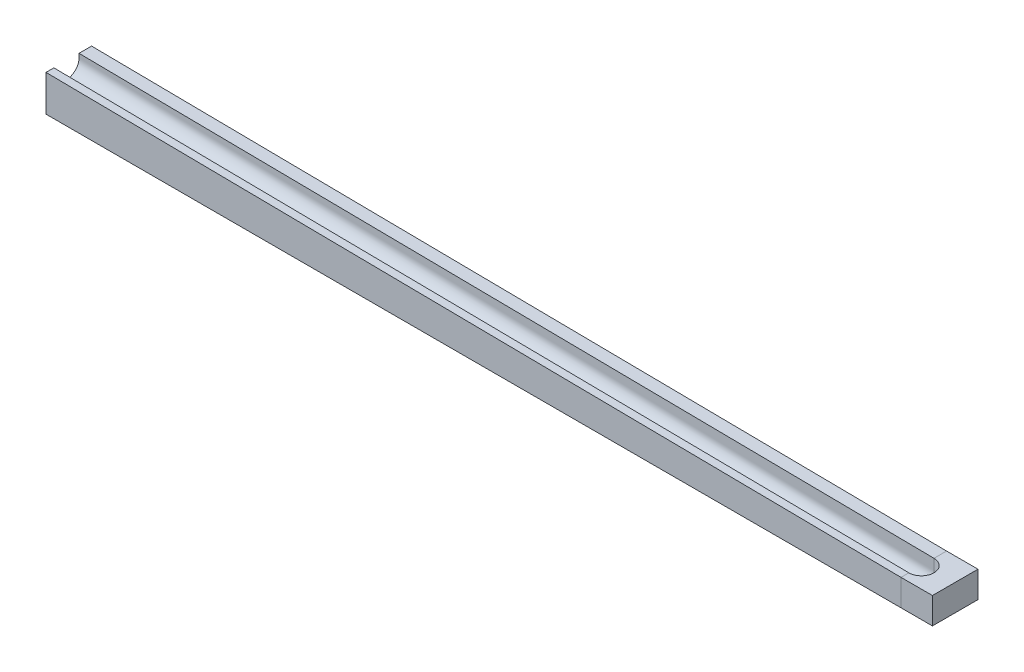
ISO-10303-21;
HEADER;
FILE_DESCRIPTION(('STEP AP214'),'2;1');
FILE_NAME('part.step','',(''),(''),'','','');
FILE_SCHEMA(('AUTOMOTIVE_DESIGN { 1 0 10303 214 1 1 1 1 }'));
ENDSEC;
DATA;
#1=APPLICATION_CONTEXT('core data for automotive mechanical design processes');
#2=APPLICATION_PROTOCOL_DEFINITION('international standard','automotive_design',2000,#1);
#3=PRODUCT_CONTEXT('',#1,'mechanical');
#4=PRODUCT('Part','Part','',(#3));
#5=PRODUCT_RELATED_PRODUCT_CATEGORY('part','',(#4));
#6=PRODUCT_DEFINITION_FORMATION('','',#4);
#7=PRODUCT_DEFINITION_CONTEXT('part definition',#1,'design');
#8=PRODUCT_DEFINITION('design','',#6,#7);
#9=PRODUCT_DEFINITION_SHAPE('','',#8);
#10=(LENGTH_UNIT() NAMED_UNIT(*) SI_UNIT(.MILLI.,.METRE.));
#11=(NAMED_UNIT(*) PLANE_ANGLE_UNIT() SI_UNIT($,.RADIAN.));
#12=(NAMED_UNIT(*) SI_UNIT($,.STERADIAN.) SOLID_ANGLE_UNIT());
#13=UNCERTAINTY_MEASURE_WITH_UNIT(LENGTH_MEASURE(1.E-05),#10,'distance_accuracy_value','');
#14=(GEOMETRIC_REPRESENTATION_CONTEXT(3) GLOBAL_UNCERTAINTY_ASSIGNED_CONTEXT((#13)) GLOBAL_UNIT_ASSIGNED_CONTEXT((#10,
#11,#12)) REPRESENTATION_CONTEXT('',''));
#15=CARTESIAN_POINT('',(0.,0.,0.));
#16=DIRECTION('',(0.,0.,1.));
#17=DIRECTION('',(1.,0.,0.));
#18=AXIS2_PLACEMENT_3D('',#15,#16,#17);
#19=CARTESIAN_POINT('',(1727.2,0.,0.));
#20=DIRECTION('',(1.,0.,0.));
#21=DIRECTION('',(0.,0.,-1.));
#22=AXIS2_PLACEMENT_3D('',#19,#20,#21);
#23=PLANE('',#22);
#24=CARTESIAN_POINT('',(1727.2,53.2712453558564,-25.4));
#25=DIRECTION('',(0.,0.,1.));
#26=VECTOR('',#25,1.);
#27=LINE('',#24,#26);
#28=CARTESIAN_POINT('',(1727.2,53.2712453558564,-25.4));
#29=VERTEX_POINT('',#28);
#30=CARTESIAN_POINT('',(1727.2,53.2712453558564,-9.525));
#31=VERTEX_POINT('',#30);
#32=EDGE_CURVE('E533',#29,#31,#27,.T.);
#33=ORIENTED_EDGE('',*,*,#32,.T.);
#34=DIRECTION('',(0.,-1.,0.));
#35=VECTOR('',#34,1.);
#36=CARTESIAN_POINT('',(1727.2,0.,-9.525));
#37=LINE('',#36,#35);
#38=CARTESIAN_POINT('',(1727.2,0.,-9.525));
#39=VERTEX_POINT('',#38);
#40=EDGE_CURVE('E367',#31,#39,#37,.T.);
#41=ORIENTED_EDGE('',*,*,#40,.T.);
#42=DIRECTION('',(0.,0.,1.));
#43=VECTOR('',#42,1.);
#44=CARTESIAN_POINT('',(1727.2,0.,-101.6));
#45=LINE('',#44,#43);
#46=CARTESIAN_POINT('',(1727.2,0.,-101.6));
#47=VERTEX_POINT('',#46);
#48=EDGE_CURVE('E361',#47,#39,#45,.T.);
#49=ORIENTED_EDGE('',*,*,#48,.F.);
#50=DIRECTION('',(0.,-1.,0.));
#51=VECTOR('',#50,1.);
#52=CARTESIAN_POINT('',(1727.2,53.2712453558564,-101.6));
#53=LINE('',#52,#51);
#54=CARTESIAN_POINT('',(1727.2,53.2712453558564,-101.6));
#55=VERTEX_POINT('',#54);
#56=EDGE_CURVE('E366',#55,#47,#53,.T.);
#57=ORIENTED_EDGE('',*,*,#56,.F.);
#58=CARTESIAN_POINT('',(1727.2,53.2712453558564,-101.6));
#59=DIRECTION('',(0.,0.,1.));
#60=VECTOR('',#59,1.);
#61=LINE('',#58,#60);
#62=CARTESIAN_POINT('',(1727.2,53.2712453558564,-76.2));
#63=VERTEX_POINT('',#62);
#64=EDGE_CURVE('E291',#55,#63,#61,.T.);
#65=ORIENTED_EDGE('',*,*,#64,.T.);
#66=DIRECTION('',(0.,-1.,0.));
#67=VECTOR('',#66,1.);
#68=CARTESIAN_POINT('',(1727.2,31.684270896,-76.2));
#69=LINE('',#68,#67);
#70=CARTESIAN_POINT('',(1727.2,31.684270896,-76.2));
#71=VERTEX_POINT('',#70);
#72=EDGE_CURVE('E283',#63,#71,#69,.T.);
#73=ORIENTED_EDGE('',*,*,#72,.T.);
#74=CARTESIAN_POINT('',(1727.2,53.2712453558564,-25.4));
#75=CARTESIAN_POINT('',(1727.2,51.8222719789833,-25.4));
#76=CARTESIAN_POINT('',(1727.2,48.5690927968063,-25.4));
#77=CARTESIAN_POINT('',(1727.2,42.2988375091047,-25.4));
#78=CARTESIAN_POINT('',(1727.2,36.1963705260442,-25.4));
#79=CARTESIAN_POINT('',(1727.2,33.0788768964686,-25.4));
#80=CARTESIAN_POINT('',(1727.2,29.8196905266811,-25.4));
#81=CARTESIAN_POINT('',(1727.2,26.2185729254273,-25.8078863752429));
#82=CARTESIAN_POINT('',(1727.2,21.2997772668116,-27.4362758721304));
#83=CARTESIAN_POINT('',(1727.2,16.949197918481,-29.9146663682663));
#84=CARTESIAN_POINT('',(1727.2,13.237288898024,-33.1162331311768));
#85=CARTESIAN_POINT('',(1727.2,10.2345042230293,-36.9141514283878));
#86=CARTESIAN_POINT('',(1727.2,8.00421031668807,-41.1983911586278));
#87=CARTESIAN_POINT('',(1727.2,6.60977360219144,-45.8589222206255));
#88=CARTESIAN_POINT('',(1727.2,6.28427089600001,-49.1375738982922));
#89=CARTESIAN_POINT('',(1727.2,6.28427089600001,-52.4624261017078));
#90=CARTESIAN_POINT('',(1727.2,6.60977360219145,-55.7410777793745));
#91=CARTESIAN_POINT('',(1727.2,8.0042103166881,-60.4016088413722));
#92=CARTESIAN_POINT('',(1727.2,10.2345042230294,-64.6858485716123));
#93=CARTESIAN_POINT('',(1727.2,13.2372888980241,-68.4837668688232));
#94=CARTESIAN_POINT('',(1727.2,16.949197918481,-71.6853336317337));
#95=CARTESIAN_POINT('',(1727.2,21.2997772668116,-74.1637241278696));
#96=CARTESIAN_POINT('',(1727.2,26.2185729254273,-75.7921136247571));
#97=CARTESIAN_POINT('',(1727.2,29.8196905266811,-76.2));
#98=CARTESIAN_POINT('',(1727.2,33.0788768964686,-76.2));
#99=CARTESIAN_POINT('',(1727.2,36.1963705260442,-76.2000000000002));
#100=CARTESIAN_POINT('',(1727.2,42.2988375091046,-76.1999999999998));
#101=CARTESIAN_POINT('',(1727.2,48.5690927968063,-76.2000000000001));
#102=CARTESIAN_POINT('',(1727.2,51.8222719789833,-76.2));
#103=CARTESIAN_POINT('',(1727.2,53.2712453558564,-76.2));
#104=B_SPLINE_CURVE_WITH_KNOTS('',3,(#74,#75,#76,#77,#78,#79,#80,#81,#82,#83,#84,#85,#86,#87,
#88,#89,#90,#91,#92,#93,#94,#95,#96,#97,#98,#99,#100,#101,#102,#103),.UNSPECIFIED.,.F.,.F.,(4,1,
1,1,2,1,1,1,1,1,1,1,2,1,1,1,1,1,1,1,2,1,1,1,4),(0.717527395723814,0.727137951958238,
0.736748508192662,0.746359064427086,0.755969620661509,0.768818880311559,0.781668139961609,
0.794517399611658,0.807366659261708,0.820215918911758,0.833065178561808,0.845914438211857,
0.858763697861907,0.871612957511957,0.884462217162006,0.897311476812056,0.910160736462106,
0.923009996112156,0.935859255762205,0.948708515412255,0.961557775062305,0.971168331296729,
0.980778887531152,0.990389443765576,1.),.UNSPECIFIED.);
#105=CARTESIAN_POINT('',(1727.2,6.28427089600001,-50.7999999999441));
#106=VERTEX_POINT('',#105);
#107=EDGE_CURVE('E287',#71,#106,#104,.F.);
#108=ORIENTED_EDGE('',*,*,#107,.T.);
#109=CARTESIAN_POINT('',(1727.2,31.684270896,-50.8));
#110=DIRECTION('',(1.,0.,0.));
#111=DIRECTION('',(0.,0.,-1.));
#112=AXIS2_PLACEMENT_3D('',#109,#110,#111);
#113=CIRCLE('',#112,25.4);
#114=CARTESIAN_POINT('',(1727.2,31.684270896,-25.4));
#115=VERTEX_POINT('',#114);
#116=EDGE_CURVE('E14',#115,#106,#113,.T.);
#117=ORIENTED_EDGE('',*,*,#116,.F.);
#118=DIRECTION('',(0.,1.,0.));
#119=VECTOR('',#118,1.);
#120=CARTESIAN_POINT('',(1727.2,31.684270896,-25.4));
#121=LINE('',#120,#119);
#122=EDGE_CURVE('E301',#115,#29,#121,.T.);
#123=ORIENTED_EDGE('',*,*,#122,.T.);
#124=EDGE_LOOP('',(#33,#41,#49,#57,#65,#73,#108,#117,#123));
#125=FACE_BOUND('',#124,.T.);
#126=CARTESIAN_POINT('',(1727.2,40.2462030974921,-14.6971858573821));
#127=DIRECTION('',(1.,0.,0.));
#128=DIRECTION('',(0.,0.,-1.));
#129=AXIS2_PLACEMENT_3D('',#126,#127,#128);
#130=CIRCLE('',#129,1.778);
#131=CARTESIAN_POINT('',(1727.2,40.2462030974921,-16.4751858573821));
#132=VERTEX_POINT('',#131);
#133=EDGE_CURVE('E341',#132,#132,#130,.T.);
#134=ORIENTED_EDGE('',*,*,#133,.F.);
#135=EDGE_LOOP('',(#134));
#136=FACE_BOUND('',#135,.T.);
#137=CARTESIAN_POINT('',(1727.2,21.6704812979709,-14.6971858573821));
#138=DIRECTION('',(1.,0.,0.));
#139=DIRECTION('',(0.,0.,-1.));
#140=AXIS2_PLACEMENT_3D('',#137,#138,#139);
#141=CIRCLE('',#140,1.778);
#142=CARTESIAN_POINT('',(1727.2,21.6704812979709,-16.4751858573821));
#143=VERTEX_POINT('',#142);
#144=EDGE_CURVE('E421',#143,#143,#141,.T.);
#145=ORIENTED_EDGE('',*,*,#144,.F.);
#146=EDGE_LOOP('',(#145));
#147=FACE_BOUND('',#146,.T.);
#148=CARTESIAN_POINT('',(1727.2,21.6704812979709,-86.9028141426179));
#149=DIRECTION('',(1.,0.,0.));
#150=DIRECTION('',(0.,0.,1.));
#151=AXIS2_PLACEMENT_3D('',#148,#149,#150);
#152=CIRCLE('',#151,1.77799999999999);
#153=CARTESIAN_POINT('',(1727.2,21.6704812979709,-85.1248141426179));
#154=VERTEX_POINT('',#153);
#155=EDGE_CURVE('E424',#154,#154,#152,.T.);
#156=ORIENTED_EDGE('',*,*,#155,.F.);
#157=EDGE_LOOP('',(#156));
#158=FACE_BOUND('',#157,.T.);
#159=CARTESIAN_POINT('',(1727.2,40.2462030974921,-86.9028141426179));
#160=DIRECTION('',(1.,0.,0.));
#161=DIRECTION('',(0.,0.,1.));
#162=AXIS2_PLACEMENT_3D('',#159,#160,#161);
#163=CIRCLE('',#162,1.77799999999999);
#164=CARTESIAN_POINT('',(1727.2,40.2462030974921,-85.1248141426179));
#165=VERTEX_POINT('',#164);
#166=EDGE_CURVE('E223',#165,#165,#163,.T.);
#167=ORIENTED_EDGE('',*,*,#166,.F.);
#168=EDGE_LOOP('',(#167));
#169=FACE_BOUND('',#168,.T.);
#170=ADVANCED_FACE('F213',(#125,#136,#147,#158,#169),#23,.T.);
#171=CARTESIAN_POINT('',(1727.2,53.2712453558564,-101.6));
#172=DIRECTION('',(0.,0.,-1.));
#173=DIRECTION('',(0.,-1.,0.));
#174=AXIS2_PLACEMENT_3D('',#171,#172,#173);
#175=PLANE('',#174);
#176=CARTESIAN_POINT('',(1727.2,53.2712453558564,-101.6));
#177=CARTESIAN_POINT('',(1151.46666666667,59.8981635705709,-101.6));
#178=CARTESIAN_POINT('',(575.733333333333,66.5250817852855,-101.6));
#179=CARTESIAN_POINT('',(0.,73.152,-101.6));
#180=B_SPLINE_CURVE_WITH_KNOTS('',3,(#176,#177,#178,#179),.UNSPECIFIED.,.F.,.F.,(4,4),(0.,1.),.UNSPECIFIED.);
#181=CARTESIAN_POINT('',(0.,73.152,-101.6));
#182=VERTEX_POINT('',#181);
#183=EDGE_CURVE('E331',#55,#182,#180,.T.);
#184=ORIENTED_EDGE('',*,*,#183,.F.);
#185=ORIENTED_EDGE('',*,*,#56,.T.);
#186=CARTESIAN_POINT('',(1727.2,0.,-101.6));
#187=CARTESIAN_POINT('',(1151.46666666667,0.,-101.6));
#188=CARTESIAN_POINT('',(575.733333333333,0.,-101.6));
#189=CARTESIAN_POINT('',(0.,0.,-101.6));
#190=B_SPLINE_CURVE_WITH_KNOTS('',3,(#186,#187,#188,#189),.UNSPECIFIED.,.F.,.F.,(4,4),(0.,1.),.UNSPECIFIED.);
#191=CARTESIAN_POINT('',(0.,0.,-101.6));
#192=VERTEX_POINT('',#191);
#193=EDGE_CURVE('E319',#47,#192,#190,.T.);
#194=ORIENTED_EDGE('',*,*,#193,.T.);
#195=DIRECTION('',(0.,1.,0.));
#196=VECTOR('',#195,1.);
#197=CARTESIAN_POINT('',(0.,0.,-101.6));
#198=LINE('',#197,#196);
#199=EDGE_CURVE('E458',#192,#182,#198,.T.);
#200=ORIENTED_EDGE('',*,*,#199,.T.);
#201=EDGE_LOOP('',(#184,#185,#194,#200));
#202=FACE_BOUND('',#201,.T.);
#203=ADVANCED_FACE('F396',(#202),#175,.T.);
#204=CARTESIAN_POINT('',(1727.2,0.,-101.6));
#205=DIRECTION('',(0.,-1.,0.));
#206=DIRECTION('',(0.,0.,1.));
#207=AXIS2_PLACEMENT_3D('',#204,#205,#206);
#208=PLANE('',#207);
#209=ORIENTED_EDGE('',*,*,#193,.F.);
#210=ORIENTED_EDGE('',*,*,#48,.T.);
#211=DIRECTION('',(1.,0.,0.));
#212=VECTOR('',#211,1.);
#213=CARTESIAN_POINT('',(-73.7695108361169,0.,-9.525));
#214=LINE('',#213,#212);
#215=CARTESIAN_POINT('',(0.,0.,-9.52499999999999));
#216=VERTEX_POINT('',#215);
#217=EDGE_CURVE('E354',#216,#39,#214,.T.);
#218=ORIENTED_EDGE('',*,*,#217,.F.);
#219=DIRECTION('',(0.,0.,-1.));
#220=VECTOR('',#219,1.);
#221=CARTESIAN_POINT('',(0.,0.,0.));
#222=LINE('',#221,#220);
#223=EDGE_CURVE('E466',#216,#192,#222,.T.);
#224=ORIENTED_EDGE('',*,*,#223,.T.);
#225=EDGE_LOOP('',(#209,#210,#218,#224));
#226=FACE_BOUND('',#225,.T.);
#227=ADVANCED_FACE('F448',(#226),#208,.T.);
#228=CARTESIAN_POINT('',(1727.2,53.2712453558564,0.));
#229=DIRECTION('',(0.0115096328059122,0.999933761982599,0.));
#230=DIRECTION('',(0.,0.,-1.));
#231=AXIS2_PLACEMENT_3D('',#228,#229,#230);
#232=PLANE('',#231);
#233=DIRECTION('',(-0.999933761982599,0.0115096328059122,0.));
#234=VECTOR('',#233,1.);
#235=CARTESIAN_POINT('',(1727.2,53.2712453558564,-9.525));
#236=LINE('',#235,#234);
#237=CARTESIAN_POINT('',(0.,73.152,-9.525));
#238=VERTEX_POINT('',#237);
#239=EDGE_CURVE('E238',#31,#238,#236,.T.);
#240=ORIENTED_EDGE('',*,*,#239,.F.);
#241=ORIENTED_EDGE('',*,*,#32,.F.);
#242=CARTESIAN_POINT('',(1727.2,53.2712453558564,-25.4));
#243=CARTESIAN_POINT('',(1151.46666666667,59.898163570571,-25.4));
#244=CARTESIAN_POINT('',(575.733333333333,66.5250817852855,-25.4));
#245=CARTESIAN_POINT('',(0.,73.152,-25.4));
#246=B_SPLINE_CURVE_WITH_KNOTS('',3,(#242,#243,#244,#245),.UNSPECIFIED.,.F.,.F.,(4,4),(0.,1.),.UNSPECIFIED.);
#247=CARTESIAN_POINT('',(0.,73.152,-25.4));
#248=VERTEX_POINT('',#247);
#249=EDGE_CURVE('E312',#29,#248,#246,.T.);
#250=ORIENTED_EDGE('',*,*,#249,.T.);
#251=DIRECTION('',(0.,0.,1.));
#252=VECTOR('',#251,1.);
#253=CARTESIAN_POINT('',(0.,73.152,0.));
#254=LINE('',#253,#252);
#255=EDGE_CURVE('E546',#248,#238,#254,.T.);
#256=ORIENTED_EDGE('',*,*,#255,.T.);
#257=EDGE_LOOP('',(#240,#241,#250,#256));
#258=FACE_BOUND('',#257,.T.);
#259=ADVANCED_FACE('F453',(#258),#232,.T.);
#260=CARTESIAN_POINT('',(0.,65.118135448,-50.8));
#261=DIRECTION('',(1.,0.,0.));
#262=DIRECTION('',(0.,0.,-1.));
#263=AXIS2_PLACEMENT_3D('',#260,#261,#262);
#264=PLANE('',#263);
#265=CARTESIAN_POINT('',(0.,40.2462030974921,-14.6971858573821));
#266=DIRECTION('',(1.,0.,0.));
#267=DIRECTION('',(0.,0.,-1.));
#268=AXIS2_PLACEMENT_3D('',#265,#266,#267);
#269=CIRCLE('',#268,1.778);
#270=CARTESIAN_POINT('',(0.,40.2462030974921,-16.4751858573821));
#271=VERTEX_POINT('',#270);
#272=EDGE_CURVE('E350',#271,#271,#269,.F.);
#273=ORIENTED_EDGE('',*,*,#272,.F.);
#274=EDGE_LOOP('',(#273));
#275=FACE_BOUND('',#274,.T.);
#276=CARTESIAN_POINT('',(0.,21.6704812979709,-14.6971858573821));
#277=DIRECTION('',(1.,0.,0.));
#278=DIRECTION('',(0.,0.,-1.));
#279=AXIS2_PLACEMENT_3D('',#276,#277,#278);
#280=CIRCLE('',#279,1.778);
#281=CARTESIAN_POINT('',(0.,21.6704812979709,-16.4751858573821));
#282=VERTEX_POINT('',#281);
#283=EDGE_CURVE('E346',#282,#282,#280,.F.);
#284=ORIENTED_EDGE('',*,*,#283,.F.);
#285=EDGE_LOOP('',(#284));
#286=FACE_BOUND('',#285,.T.);
#287=CARTESIAN_POINT('',(0.,21.6704812979709,-86.9028141426179));
#288=DIRECTION('',(1.,0.,0.));
#289=DIRECTION('',(0.,0.,-1.));
#290=AXIS2_PLACEMENT_3D('',#287,#288,#289);
#291=CIRCLE('',#290,1.77799999999999);
#292=CARTESIAN_POINT('',(0.,21.6704812979709,-88.6808141426179));
#293=VERTEX_POINT('',#292);
#294=EDGE_CURVE('E342',#293,#293,#291,.F.);
#295=ORIENTED_EDGE('',*,*,#294,.F.);
#296=EDGE_LOOP('',(#295));
#297=FACE_BOUND('',#296,.T.);
#298=CARTESIAN_POINT('',(0.,40.2462030974921,-86.9028141426179));
#299=DIRECTION('',(1.,0.,0.));
#300=DIRECTION('',(0.,0.,-1.));
#301=AXIS2_PLACEMENT_3D('',#298,#299,#300);
#302=CIRCLE('',#301,1.77799999999999);
#303=CARTESIAN_POINT('',(0.,40.2462030974921,-88.6808141426179));
#304=VERTEX_POINT('',#303);
#305=EDGE_CURVE('E337',#304,#304,#302,.F.);
#306=ORIENTED_EDGE('',*,*,#305,.F.);
#307=EDGE_LOOP('',(#306));
#308=FACE_BOUND('',#307,.T.);
#309=ORIENTED_EDGE('',*,*,#223,.F.);
#310=DIRECTION('',(0.,-1.,0.));
#311=VECTOR('',#310,1.);
#312=CARTESIAN_POINT('',(0.,0.,-9.525));
#313=LINE('',#312,#311);
#314=EDGE_CURVE('E336',#238,#216,#313,.T.);
#315=ORIENTED_EDGE('',*,*,#314,.F.);
#316=ORIENTED_EDGE('',*,*,#255,.F.);
#317=DIRECTION('',(0.,1.,0.));
#318=VECTOR('',#317,1.);
#319=CARTESIAN_POINT('',(0.,65.118135448,-25.4));
#320=LINE('',#319,#318);
#321=CARTESIAN_POINT('',(0.,65.1181354479846,-25.4));
#322=VERTEX_POINT('',#321);
#323=EDGE_CURVE('E549',#322,#248,#320,.T.);
#324=ORIENTED_EDGE('',*,*,#323,.F.);
#325=CARTESIAN_POINT('',(0.,65.118135448,-50.8));
#326=DIRECTION('',(-1.,0.,0.));
#327=DIRECTION('',(0.,0.,-1.));
#328=AXIS2_PLACEMENT_3D('',#325,#326,#327);
#329=CIRCLE('',#328,25.4);
#330=CARTESIAN_POINT('',(0.,65.1181354484449,-76.2));
#331=VERTEX_POINT('',#330);
#332=EDGE_CURVE('E616',#331,#322,#329,.T.);
#333=ORIENTED_EDGE('',*,*,#332,.F.);
#334=DIRECTION('',(0.,-1.,0.));
#335=VECTOR('',#334,1.);
#336=CARTESIAN_POINT('',(0.,65.118135448,-76.2));
#337=LINE('',#336,#335);
#338=CARTESIAN_POINT('',(0.,73.152,-76.2));
#339=VERTEX_POINT('',#338);
#340=EDGE_CURVE('E611',#339,#331,#337,.T.);
#341=ORIENTED_EDGE('',*,*,#340,.F.);
#342=DIRECTION('',(0.,0.,1.));
#343=VECTOR('',#342,1.);
#344=CARTESIAN_POINT('',(0.,73.152,-76.2));
#345=LINE('',#344,#343);
#346=EDGE_CURVE('E614',#182,#339,#345,.T.);
#347=ORIENTED_EDGE('',*,*,#346,.F.);
#348=ORIENTED_EDGE('',*,*,#199,.F.);
#349=EDGE_LOOP('',(#309,#315,#316,#324,#333,#341,#347,#348));
#350=FACE_BOUND('',#349,.T.);
#351=ADVANCED_FACE('F513',(#275,#286,#297,#308,#350),#264,.F.);
#352=CARTESIAN_POINT('',(1727.2,53.2712453558564,-76.2));
#353=DIRECTION('',(0.0115096328059122,0.999933761982599,0.));
#354=DIRECTION('',(0.,0.,-1.));
#355=AXIS2_PLACEMENT_3D('',#352,#353,#354);
#356=PLANE('',#355);
#357=ORIENTED_EDGE('',*,*,#64,.F.);
#358=ORIENTED_EDGE('',*,*,#183,.T.);
#359=ORIENTED_EDGE('',*,*,#346,.T.);
#360=CARTESIAN_POINT('',(1727.2,53.2712453558564,-76.2));
#361=CARTESIAN_POINT('',(1151.46666666667,59.898163570571,-76.2));
#362=CARTESIAN_POINT('',(575.733333333333,66.5250817852855,-76.2));
#363=CARTESIAN_POINT('',(0.,73.152,-76.2));
#364=B_SPLINE_CURVE_WITH_KNOTS('',3,(#360,#361,#362,#363),.UNSPECIFIED.,.F.,.F.,(4,4),(0.,1.),.UNSPECIFIED.);
#365=EDGE_CURVE('E320',#63,#339,#364,.T.);
#366=ORIENTED_EDGE('',*,*,#365,.F.);
#367=EDGE_LOOP('',(#357,#358,#359,#366));
#368=FACE_BOUND('',#367,.T.);
#369=ADVANCED_FACE('F468',(#368),#356,.T.);
#370=CARTESIAN_POINT('',(1727.2,53.2712453558564,-25.4));
#371=CARTESIAN_POINT('',(1151.46666666667,59.898163570571,-25.4));
#372=CARTESIAN_POINT('',(575.733333333333,66.5250817852855,-25.4));
#373=CARTESIAN_POINT('',(0.,73.152,-25.4));
#374=CARTESIAN_POINT('',(1727.2,51.8222719789833,-25.4));
#375=CARTESIAN_POINT('',(1151.46666666667,58.5885060761388,-25.4));
#376=CARTESIAN_POINT('',(575.733333333333,65.3547401732943,-25.4));
#377=CARTESIAN_POINT('',(0.,72.1209742704498,-25.4));
#378=CARTESIAN_POINT('',(1727.2,48.5690927968063,-25.4));
#379=CARTESIAN_POINT('',(1151.46666666667,56.0098392466809,-25.4));
#380=CARTESIAN_POINT('',(575.733333333333,63.4505856965556,-25.4));
#381=CARTESIAN_POINT('',(0.,70.8913321464303,-25.4));
#382=CARTESIAN_POINT('',(1727.2,42.2988375091047,-25.4));
#383=CARTESIAN_POINT('',(1151.46666666667,51.2561791932164,-25.4));
#384=CARTESIAN_POINT('',(575.733333333334,60.2135208773281,-25.4));
#385=CARTESIAN_POINT('',(0.,69.1708625614398,-25.4));
#386=CARTESIAN_POINT('',(1727.2,36.1963705260442,-25.4));
#387=CARTESIAN_POINT('',(1151.46666666666,46.6028842048706,-25.4));
#388=CARTESIAN_POINT('',(575.733333333332,57.009397883697,-25.4));
#389=CARTESIAN_POINT('',(0.,67.4159115625234,-25.4));
#390=CARTESIAN_POINT('',(1727.2,33.0788768964686,-25.4));
#391=CARTESIAN_POINT('',(1151.46666666667,44.1210279653809,-25.4));
#392=CARTESIAN_POINT('',(575.733333333333,55.1631790342932,-25.4));
#393=CARTESIAN_POINT('',(0.,66.2053301032055,-25.4));
#394=CARTESIAN_POINT('',(1727.2,29.8196905266811,-25.4));
#395=CARTESIAN_POINT('',(1151.46666666667,41.1013144565216,-25.4));
#396=CARTESIAN_POINT('',(575.733333333333,52.3829383863621,-25.4));
#397=CARTESIAN_POINT('',(0.,63.6645623162026,-25.4));
#398=CARTESIAN_POINT('',(1727.2,26.2185729254273,-25.8078863752429));
#399=CARTESIAN_POINT('',(1151.46666666666,37.7044478756925,-25.7552715782859));
#400=CARTESIAN_POINT('',(575.733333333332,49.1903228259576,-25.7026567813288));
#401=CARTESIAN_POINT('',(0.,60.6761977762227,-25.6500419843718));
#402=CARTESIAN_POINT('',(1727.2,21.2997772668116,-27.4362758721304));
#403=CARTESIAN_POINT('',(1151.46666666667,32.9014794858328,-27.2538296069292));
#404=CARTESIAN_POINT('',(575.733333333334,44.5031817048539,-27.071383341728));
#405=CARTESIAN_POINT('',(0.,56.104883923875,-26.8889370765268));
#406=CARTESIAN_POINT('',(1727.2,16.949197918481,-29.9146663682663));
#407=CARTESIAN_POINT('',(1151.46666666667,28.5181020451867,-29.6315103720668));
#408=CARTESIAN_POINT('',(575.733333333334,40.0870061718923,-29.3483543758672));
#409=CARTESIAN_POINT('',(0.,51.655910298598,-29.0651983796677));
#410=CARTESIAN_POINT('',(1727.2,13.237288898024,-33.1162331311768));
#411=CARTESIAN_POINT('',(1151.46666666666,24.6858787933538,-32.804560973782));
#412=CARTESIAN_POINT('',(575.733333333332,36.1344686886835,-32.4928888163871));
#413=CARTESIAN_POINT('',(0.,47.5830585840133,-32.1812166589923));
#414=CARTESIAN_POINT('',(1727.2,10.2345042230293,-36.9141514283878));
#415=CARTESIAN_POINT('',(1151.46666666667,21.5402719587932,-36.6572409446518));
#416=CARTESIAN_POINT('',(575.733333333333,32.8460396945572,-36.4003304609157));
#417=CARTESIAN_POINT('',(0.,44.1518074303211,-36.1434199771797));
#418=CARTESIAN_POINT('',(1727.2,8.00421031668807,-41.1983911586278));
#419=CARTESIAN_POINT('',(1151.46666666667,19.1998929890256,-41.0512114583086));
#420=CARTESIAN_POINT('',(575.733333333334,30.3955756613631,-40.9040317579894));
#421=CARTESIAN_POINT('',(0.,41.5912583337006,-40.7568520576702));
#422=CARTESIAN_POINT('',(1727.2,6.60977360219144,-45.8589222206255));
#423=CARTESIAN_POINT('',(1151.46666666667,17.7553724083613,-45.8231290524851));
#424=CARTESIAN_POINT('',(575.733333333334,28.9009712145312,-45.7873358843447));
#425=CARTESIAN_POINT('',(0.,40.0465700207011,-45.7515427162044));
#426=CARTESIAN_POINT('',(1727.2,6.28427089600001,-49.1375738982922));
#427=CARTESIAN_POINT('',(1151.46666666667,17.4288924133333,-49.1375738982922));
#428=CARTESIAN_POINT('',(575.733333333333,28.5735139306667,-49.1375738982922));
#429=CARTESIAN_POINT('',(0.,39.718135448,-49.1375738982922));
#430=CARTESIAN_POINT('',(1727.2,6.28427089600001,-52.4624261017078));
#431=CARTESIAN_POINT('',(1151.46666666667,17.4288924133333,-52.4624261017078));
#432=CARTESIAN_POINT('',(575.733333333333,28.5735139306667,-52.4624261017078));
#433=CARTESIAN_POINT('',(0.,39.718135448,-52.4624261017078));
#434=CARTESIAN_POINT('',(1727.2,6.60977360219145,-55.7410777793745));
#435=CARTESIAN_POINT('',(1151.46666666667,17.7553724083613,-55.7768709475148));
#436=CARTESIAN_POINT('',(575.733333333334,28.9009712145312,-55.8126641156552));
#437=CARTESIAN_POINT('',(0.,40.0465700207011,-55.8484572837955));
#438=CARTESIAN_POINT('',(1727.2,8.0042103166881,-60.4016088413722));
#439=CARTESIAN_POINT('',(1151.46666666667,19.1998929890256,-60.5487885416915));
#440=CARTESIAN_POINT('',(575.733333333334,30.3955756613631,-60.6959682420107));
#441=CARTESIAN_POINT('',(0.,41.5912583337006,-60.8431479423299));
#442=CARTESIAN_POINT('',(1727.2,10.2345042230294,-64.6858485716123));
#443=CARTESIAN_POINT('',(1151.46666666667,21.5402719587933,-64.9427590553482));
#444=CARTESIAN_POINT('',(575.733333333333,32.8460396945572,-65.1996695390842));
#445=CARTESIAN_POINT('',(0.,44.1518074303211,-65.4565800228201));
#446=CARTESIAN_POINT('',(1727.2,13.2372888980241,-68.4837668688232));
#447=CARTESIAN_POINT('',(1151.46666666667,24.6858787933538,-68.7954390262181));
#448=CARTESIAN_POINT('',(575.733333333333,36.1344686886835,-69.107111183613));
#449=CARTESIAN_POINT('',(0.,47.5830585840132,-69.418783341008));
#450=CARTESIAN_POINT('',(1727.2,16.949197918481,-71.6853336317337));
#451=CARTESIAN_POINT('',(1151.46666666667,28.5181020451867,-71.9684896279332));
#452=CARTESIAN_POINT('',(575.733333333333,40.0870061718923,-72.2516456241327));
#453=CARTESIAN_POINT('',(0.,51.655910298598,-72.5348016203322));
#454=CARTESIAN_POINT('',(1727.2,21.2997772668116,-74.1637241278696));
#455=CARTESIAN_POINT('',(1151.46666666667,32.9014794858327,-74.3461703930709));
#456=CARTESIAN_POINT('',(575.733333333334,44.5031817048539,-74.5286166582721));
#457=CARTESIAN_POINT('',(0.,56.104883923875,-74.7110629234733));
#458=CARTESIAN_POINT('',(1727.2,26.2185729254273,-75.7921136247571));
#459=CARTESIAN_POINT('',(1151.46666666667,37.7044478756925,-75.8447284217141));
#460=CARTESIAN_POINT('',(575.733333333333,49.1903228259576,-75.8973432186712));
#461=CARTESIAN_POINT('',(0.,60.6761977762228,-75.9499580156282));
#462=CARTESIAN_POINT('',(1727.2,29.8196905266811,-76.2));
#463=CARTESIAN_POINT('',(1151.46666666667,41.1013144565216,-76.2));
#464=CARTESIAN_POINT('',(575.733333333333,52.3829383863621,-76.2));
#465=CARTESIAN_POINT('',(0.,63.6645623162026,-76.2));
#466=CARTESIAN_POINT('',(1727.2,33.0788768964686,-76.2));
#467=CARTESIAN_POINT('',(1151.46666666667,44.1210279653809,-76.2));
#468=CARTESIAN_POINT('',(575.733333333333,55.1631790342932,-76.2));
#469=CARTESIAN_POINT('',(0.,66.2053301032055,-76.2));
#470=CARTESIAN_POINT('',(1727.2,36.1963705260442,-76.2000000000002));
#471=CARTESIAN_POINT('',(1151.46666666667,46.6028842048707,-76.2000000000001));
#472=CARTESIAN_POINT('',(575.733333333333,57.0093978836971,-76.2000000000001));
#473=CARTESIAN_POINT('',(0.,67.4159115625235,-76.2));
#474=CARTESIAN_POINT('',(1727.2,42.2988375091046,-76.1999999999998));
#475=CARTESIAN_POINT('',(1151.46666666667,51.2561791932163,-76.1999999999998));
#476=CARTESIAN_POINT('',(575.733333333333,60.213520877328,-76.1999999999999));
#477=CARTESIAN_POINT('',(0.,69.1708625614397,-76.2));
#478=CARTESIAN_POINT('',(1727.2,48.5690927968063,-76.2000000000001));
#479=CARTESIAN_POINT('',(1151.46666666667,56.009839246681,-76.2000000000001));
#480=CARTESIAN_POINT('',(575.733333333333,63.4505856965557,-76.2));
#481=CARTESIAN_POINT('',(0.,70.8913321464304,-76.2));
#482=CARTESIAN_POINT('',(1727.2,51.8222719789833,-76.2));
#483=CARTESIAN_POINT('',(1151.46666666667,58.5885060761388,-76.2));
#484=CARTESIAN_POINT('',(575.733333333333,65.3547401732943,-76.2));
#485=CARTESIAN_POINT('',(0.,72.1209742704498,-76.2));
#486=CARTESIAN_POINT('',(1727.2,53.2712453558564,-76.2));
#487=CARTESIAN_POINT('',(1151.46666666667,59.898163570571,-76.2));
#488=CARTESIAN_POINT('',(575.733333333333,66.5250817852855,-76.2));
#489=CARTESIAN_POINT('',(0.,73.152,-76.2));
#490=B_SPLINE_SURFACE_WITH_KNOTS('',3,3,((#370,#371,#372,#373),(#374,#375,#376,#377),(#378,#379,
#380,#381),(#382,#383,#384,#385),(#386,#387,#388,#389),(#390,#391,#392,#393),(#394,#395,#396,
#397),(#398,#399,#400,#401),(#402,#403,#404,#405),(#406,#407,#408,#409),(#410,#411,#412,#413),
(#414,#415,#416,#417),(#418,#419,#420,#421),(#422,#423,#424,#425),(#426,#427,#428,#429),(#430,
#431,#432,#433),(#434,#435,#436,#437),(#438,#439,#440,#441),(#442,#443,#444,#445),(#446,#447,
#448,#449),(#450,#451,#452,#453),(#454,#455,#456,#457),(#458,#459,#460,#461),(#462,#463,#464,
#465),(#466,#467,#468,#469),(#470,#471,#472,#473),(#474,#475,#476,#477),(#478,#479,#480,#481),
(#482,#483,#484,#485),(#486,#487,#488,#489)),.UNSPECIFIED.,.F.,.F.,.F.,(4,1,1,1,2,1,1,1,1,1,1,1,
2,1,1,1,1,1,1,1,2,1,1,1,4),(4,4),(0.717527395723814,0.727137951958238,0.736748508192662,
0.746359064427086,0.755969620661509,0.768818880311559,0.781668139961609,0.794517399611658,
0.807366659261708,0.820215918911758,0.833065178561808,0.845914438211857,0.858763697861907,
0.871612957511957,0.884462217162006,0.897311476812056,0.910160736462106,0.923009996112156,
0.935859255762205,0.948708515412255,0.961557775062305,0.971168331296729,0.980778887531152,
0.990389443765576,1.),(0.,1.),.UNSPECIFIED.);
#491=ORIENTED_EDGE('',*,*,#122,.F.);
#492=ORIENTED_EDGE('',*,*,#116,.T.);
#493=ORIENTED_EDGE('',*,*,#107,.F.);
#494=ORIENTED_EDGE('',*,*,#72,.F.);
#495=ORIENTED_EDGE('',*,*,#365,.T.);
#496=ORIENTED_EDGE('',*,*,#340,.T.);
#497=ORIENTED_EDGE('',*,*,#332,.T.);
#498=ORIENTED_EDGE('',*,*,#323,.T.);
#499=ORIENTED_EDGE('',*,*,#249,.F.);
#500=EDGE_LOOP('',(#491,#492,#493,#494,#495,#496,#497,#498,#499));
#501=FACE_BOUND('',#500,.T.);
#502=ADVANCED_FACE('F298',(#501),#490,.T.);
#503=CARTESIAN_POINT('',(-73.7695108361169,40.2462030974921,-14.6971858573821));
#504=DIRECTION('',(1.,0.,0.));
#505=DIRECTION('',(0.,0.,-1.));
#506=AXIS2_PLACEMENT_3D('',#503,#504,#505);
#507=CYLINDRICAL_SURFACE('',#506,1.778);
#508=ORIENTED_EDGE('',*,*,#272,.T.);
#509=EDGE_LOOP('',(#508));
#510=FACE_BOUND('',#509,.T.);
#511=ORIENTED_EDGE('',*,*,#133,.T.);
#512=EDGE_LOOP('',(#511));
#513=FACE_BOUND('',#512,.T.);
#514=ADVANCED_FACE('F397',(#510,#513),#507,.F.);
#515=CARTESIAN_POINT('',(-73.7695108361169,21.6704812979709,-14.6971858573821));
#516=DIRECTION('',(1.,0.,0.));
#517=DIRECTION('',(0.,0.,-1.));
#518=AXIS2_PLACEMENT_3D('',#515,#516,#517);
#519=CYLINDRICAL_SURFACE('',#518,1.778);
#520=ORIENTED_EDGE('',*,*,#283,.T.);
#521=EDGE_LOOP('',(#520));
#522=FACE_BOUND('',#521,.T.);
#523=ORIENTED_EDGE('',*,*,#144,.T.);
#524=EDGE_LOOP('',(#523));
#525=FACE_BOUND('',#524,.T.);
#526=ADVANCED_FACE('F444',(#522,#525),#519,.F.);
#527=CARTESIAN_POINT('',(-73.7695108361169,21.6704812979709,-86.9028141426179));
#528=DIRECTION('',(1.,0.,0.));
#529=DIRECTION('',(0.,0.,-1.));
#530=AXIS2_PLACEMENT_3D('',#527,#528,#529);
#531=CYLINDRICAL_SURFACE('',#530,1.77799999999999);
#532=ORIENTED_EDGE('',*,*,#294,.T.);
#533=EDGE_LOOP('',(#532));
#534=FACE_BOUND('',#533,.T.);
#535=ORIENTED_EDGE('',*,*,#155,.T.);
#536=EDGE_LOOP('',(#535));
#537=FACE_BOUND('',#536,.T.);
#538=ADVANCED_FACE('F436',(#534,#537),#531,.F.);
#539=CARTESIAN_POINT('',(-73.7695108361169,40.2462030974921,-86.9028141426179));
#540=DIRECTION('',(1.,0.,0.));
#541=DIRECTION('',(0.,0.,-1.));
#542=AXIS2_PLACEMENT_3D('',#539,#540,#541);
#543=CYLINDRICAL_SURFACE('',#542,1.77799999999999);
#544=ORIENTED_EDGE('',*,*,#305,.T.);
#545=EDGE_LOOP('',(#544));
#546=FACE_BOUND('',#545,.T.);
#547=ORIENTED_EDGE('',*,*,#166,.T.);
#548=EDGE_LOOP('',(#547));
#549=FACE_BOUND('',#548,.T.);
#550=ADVANCED_FACE('F433',(#546,#549),#543,.F.);
#551=CARTESIAN_POINT('',(-73.7695108361169,0.,-9.525));
#552=DIRECTION('',(0.,0.,-1.));
#553=DIRECTION('',(-1.,0.,0.));
#554=AXIS2_PLACEMENT_3D('',#551,#552,#553);
#555=PLANE('',#554);
#556=ORIENTED_EDGE('',*,*,#40,.F.);
#557=ORIENTED_EDGE('',*,*,#239,.T.);
#558=ORIENTED_EDGE('',*,*,#314,.T.);
#559=ORIENTED_EDGE('',*,*,#217,.T.);
#560=EDGE_LOOP('',(#556,#557,#558,#559));
#561=FACE_BOUND('',#560,.T.);
#562=ADVANCED_FACE('F215',(#561),#555,.F.);
#563=CLOSED_SHELL('',(#170,#203,#227,#259,#351,#369,#502,#514,#526,#538,#550,#562));
#564=MANIFOLD_SOLID_BREP('B2',#563);
#565=CARTESIAN_POINT('',(1727.2,53.2712453558564,-101.6));
#566=DIRECTION('',(0.,0.,-1.));
#567=DIRECTION('',(0.,-1.,0.));
#568=AXIS2_PLACEMENT_3D('',#565,#566,#567);
#569=PLANE('',#568);
#570=DIRECTION('',(0.,-1.,0.));
#571=VECTOR('',#570,1.);
#572=CARTESIAN_POINT('',(1727.2,53.2712453558564,-101.6));
#573=LINE('',#572,#571);
#574=CARTESIAN_POINT('',(1727.2,53.2712453558564,-101.6));
#575=VERTEX_POINT('',#574);
#576=CARTESIAN_POINT('',(1727.2,0.,-101.6));
#577=VERTEX_POINT('',#576);
#578=EDGE_CURVE('E851',#575,#577,#573,.T.);
#579=ORIENTED_EDGE('',*,*,#578,.F.);
#580=DIRECTION('',(-1.,0.,0.));
#581=VECTOR('',#580,1.);
#582=CARTESIAN_POINT('',(1790.7,53.2712453558564,-101.6));
#583=LINE('',#582,#581);
#584=CARTESIAN_POINT('',(1790.7,53.2712453558564,-101.6));
#585=VERTEX_POINT('',#584);
#586=EDGE_CURVE('E982',#585,#575,#583,.T.);
#587=ORIENTED_EDGE('',*,*,#586,.F.);
#588=DIRECTION('',(0.,1.,0.));
#589=VECTOR('',#588,1.);
#590=CARTESIAN_POINT('',(1790.7,0.,-101.6));
#591=LINE('',#590,#589);
#592=CARTESIAN_POINT('',(1790.7,0.,-101.6));
#593=VERTEX_POINT('',#592);
#594=EDGE_CURVE('E988',#593,#585,#591,.T.);
#595=ORIENTED_EDGE('',*,*,#594,.F.);
#596=DIRECTION('',(-1.,0.,0.));
#597=VECTOR('',#596,1.);
#598=CARTESIAN_POINT('',(1790.7,0.,-101.6));
#599=LINE('',#598,#597);
#600=EDGE_CURVE('E987',#593,#577,#599,.T.);
#601=ORIENTED_EDGE('',*,*,#600,.T.);
#602=EDGE_LOOP('',(#579,#587,#595,#601));
#603=FACE_BOUND('',#602,.T.);
#604=ADVANCED_FACE('F841',(#603),#569,.T.);
#605=CARTESIAN_POINT('',(1790.7,0.,0.));
#606=DIRECTION('',(1.,0.,0.));
#607=DIRECTION('',(0.,0.,-1.));
#608=AXIS2_PLACEMENT_3D('',#605,#606,#607);
#609=PLANE('',#608);
#610=DIRECTION('',(0.,0.,1.));
#611=VECTOR('',#610,1.);
#612=CARTESIAN_POINT('',(1790.7,53.2712453558564,-9.525));
#613=LINE('',#612,#611);
#614=CARTESIAN_POINT('',(1790.7,53.2712453558564,-9.525));
#615=VERTEX_POINT('',#614);
#616=EDGE_CURVE('E924',#585,#615,#613,.T.);
#617=ORIENTED_EDGE('',*,*,#616,.T.);
#618=DIRECTION('',(0.,-1.,0.));
#619=VECTOR('',#618,1.);
#620=CARTESIAN_POINT('',(1790.7,53.2712453558564,-9.525));
#621=LINE('',#620,#619);
#622=CARTESIAN_POINT('',(1790.7,0.,-9.525));
#623=VERTEX_POINT('',#622);
#624=EDGE_CURVE('E1020',#615,#623,#621,.T.);
#625=ORIENTED_EDGE('',*,*,#624,.T.);
#626=DIRECTION('',(0.,0.,-1.));
#627=VECTOR('',#626,1.);
#628=CARTESIAN_POINT('',(1790.7,0.,-9.525));
#629=LINE('',#628,#627);
#630=EDGE_CURVE('E992',#623,#593,#629,.T.);
#631=ORIENTED_EDGE('',*,*,#630,.T.);
#632=ORIENTED_EDGE('',*,*,#594,.T.);
#633=EDGE_LOOP('',(#617,#625,#631,#632));
#634=FACE_BOUND('',#633,.T.);
#635=ADVANCED_FACE('F949',(#634),#609,.T.);
#636=CARTESIAN_POINT('',(1727.2,0.,-101.6));
#637=DIRECTION('',(0.,-1.,0.));
#638=DIRECTION('',(0.,0.,1.));
#639=AXIS2_PLACEMENT_3D('',#636,#637,#638);
#640=PLANE('',#639);
#641=DIRECTION('',(0.,0.,1.));
#642=VECTOR('',#641,1.);
#643=CARTESIAN_POINT('',(1727.2,0.,-101.6));
#644=LINE('',#643,#642);
#645=CARTESIAN_POINT('',(1727.2,0.,-9.525));
#646=VERTEX_POINT('',#645);
#647=EDGE_CURVE('E865',#577,#646,#644,.T.);
#648=ORIENTED_EDGE('',*,*,#647,.F.);
#649=ORIENTED_EDGE('',*,*,#600,.F.);
#650=ORIENTED_EDGE('',*,*,#630,.F.);
#651=DIRECTION('',(1.,0.,0.));
#652=VECTOR('',#651,1.);
#653=CARTESIAN_POINT('',(-73.7695108361169,0.,-9.525));
#654=LINE('',#653,#652);
#655=EDGE_CURVE('E1004',#646,#623,#654,.T.);
#656=ORIENTED_EDGE('',*,*,#655,.F.);
#657=EDGE_LOOP('',(#648,#649,#650,#656));
#658=FACE_BOUND('',#657,.T.);
#659=ADVANCED_FACE('F951',(#658),#640,.T.);
#660=CARTESIAN_POINT('',(1790.7,53.2712453558564,-9.525));
#661=DIRECTION('',(0.,-1.,0.));
#662=DIRECTION('',(0.,0.,-1.));
#663=AXIS2_PLACEMENT_3D('',#660,#661,#662);
#664=PLANE('',#663);
#665=CARTESIAN_POINT('',(1727.2,53.2712453558564,-50.8));
#666=DIRECTION('',(0.,-1.,0.));
#667=DIRECTION('',(0.,0.,-1.));
#668=AXIS2_PLACEMENT_3D('',#665,#666,#667);
#669=CIRCLE('',#668,25.4);
#670=CARTESIAN_POINT('',(1727.2,53.2712453558564,-25.4));
#671=VERTEX_POINT('',#670);
#672=CARTESIAN_POINT('',(1727.2,53.2712453558564,-76.2));
#673=VERTEX_POINT('',#672);
#674=EDGE_CURVE('E907',#671,#673,#669,.F.);
#675=ORIENTED_EDGE('',*,*,#674,.F.);
#676=DIRECTION('',(0.,0.,1.));
#677=VECTOR('',#676,1.);
#678=CARTESIAN_POINT('',(1727.2,53.2712453558564,0.));
#679=LINE('',#678,#677);
#680=CARTESIAN_POINT('',(1727.2,53.2712453558564,-9.525));
#681=VERTEX_POINT('',#680);
#682=EDGE_CURVE('E1009',#671,#681,#679,.T.);
#683=ORIENTED_EDGE('',*,*,#682,.T.);
#684=DIRECTION('',(-1.,0.,0.));
#685=VECTOR('',#684,1.);
#686=CARTESIAN_POINT('',(1790.7,53.2712453558564,-9.525));
#687=LINE('',#686,#685);
#688=EDGE_CURVE('E990',#615,#681,#687,.T.);
#689=ORIENTED_EDGE('',*,*,#688,.F.);
#690=ORIENTED_EDGE('',*,*,#616,.F.);
#691=ORIENTED_EDGE('',*,*,#586,.T.);
#692=DIRECTION('',(0.,0.,1.));
#693=VECTOR('',#692,1.);
#694=CARTESIAN_POINT('',(1727.2,53.2712453558564,-76.2));
#695=LINE('',#694,#693);
#696=EDGE_CURVE('E910',#575,#673,#695,.T.);
#697=ORIENTED_EDGE('',*,*,#696,.T.);
#698=EDGE_LOOP('',(#675,#683,#689,#690,#691,#697));
#699=FACE_BOUND('',#698,.T.);
#700=ADVANCED_FACE('F948',(#699),#664,.F.);
#701=CARTESIAN_POINT('',(1727.2,6.28427089600001,-50.8));
#702=DIRECTION('',(0.,1.,0.));
#703=DIRECTION('',(0.,0.,1.));
#704=AXIS2_PLACEMENT_3D('',#701,#702,#703);
#705=CYLINDRICAL_SURFACE('',#704,25.4);
#706=ORIENTED_EDGE('',*,*,#674,.T.);
#707=DIRECTION('',(0.,-1.,0.));
#708=VECTOR('',#707,1.);
#709=CARTESIAN_POINT('',(1727.2,31.684270896,-76.2));
#710=LINE('',#709,#708);
#711=CARTESIAN_POINT('',(1727.2,31.684270896,-76.2));
#712=VERTEX_POINT('',#711);
#713=EDGE_CURVE('E902',#673,#712,#710,.T.);
#714=ORIENTED_EDGE('',*,*,#713,.T.);
#715=CARTESIAN_POINT('',(1727.2,31.684270896,-50.8));
#716=DIRECTION('',(0.,1.,0.));
#717=DIRECTION('',(0.,0.,1.));
#718=AXIS2_PLACEMENT_3D('',#715,#716,#717);
#719=CIRCLE('',#718,25.4);
#720=CARTESIAN_POINT('',(1727.2,31.684270896,-25.4));
#721=VERTEX_POINT('',#720);
#722=EDGE_CURVE('E905',#721,#712,#719,.T.);
#723=ORIENTED_EDGE('',*,*,#722,.F.);
#724=DIRECTION('',(0.,1.,0.));
#725=VECTOR('',#724,1.);
#726=CARTESIAN_POINT('',(1727.2,31.684270896,-25.4));
#727=LINE('',#726,#725);
#728=EDGE_CURVE('E918',#721,#671,#727,.T.);
#729=ORIENTED_EDGE('',*,*,#728,.T.);
#730=EDGE_LOOP('',(#706,#714,#723,#729));
#731=FACE_BOUND('',#730,.T.);
#732=ADVANCED_FACE('F904',(#731),#705,.F.);
#733=CARTESIAN_POINT('',(1727.2,31.684270896,-50.8));
#734=DIRECTION('',(0.,1.,0.));
#735=DIRECTION('',(0.,0.,1.));
#736=AXIS2_PLACEMENT_3D('',#733,#734,#735);
#737=SPHERICAL_SURFACE('',#736,25.4);
#738=CARTESIAN_POINT('',(1727.2,31.684270896,-25.4));
#739=CARTESIAN_POINT('',(1727.2,29.1823116132943,-25.4));
#740=CARTESIAN_POINT('',(1727.2,26.7289767167972,-25.8880538777566));
#741=CARTESIAN_POINT('',(1727.2,24.2748353225314,-26.3762681960482));
#742=CARTESIAN_POINT('',(1727.2,21.9641117139396,-27.333459874208));
#743=CARTESIAN_POINT('',(1727.2,19.6523718469612,-28.2910725261558));
#744=CARTESIAN_POINT('',(1727.2,17.5727869773195,-29.6806718475037));
#745=CARTESIAN_POINT('',(1727.2,15.4922875043221,-31.0708823159229));
#746=CARTESIAN_POINT('',(1727.2,13.7237586538815,-32.8394877578419));
#747=CARTESIAN_POINT('',(1727.2,11.9544698478441,-34.6088531882698));
#748=CARTESIAN_POINT('',(1727.2,10.5649427435348,-36.6885160812731));
#749=CARTESIAN_POINT('',(1727.2,9.17484605883028,-38.7690314479047));
#750=CARTESIAN_POINT('',(1727.2,8.21773077022936,-41.079840817888));
#751=CARTESIAN_POINT('',(1727.2,7.26023281637208,-43.3915740749626));
#752=CARTESIAN_POINT('',(1727.2,6.77232477376749,-45.8447058207424));
#753=CARTESIAN_POINT('',(1727.2,6.28427089600001,-48.2985708048305));
#754=CARTESIAN_POINT('',(1727.2,6.28427089600001,-50.7999999999441));
#755=B_SPLINE_CURVE_WITH_KNOTS('',2,(#738,#739,#740,#741,#742,#743,#744,#745,#746,#747,#748,
#749,#750,#751,#752,#753,#754),.UNSPECIFIED.,.F.,.F.,(3,2,2,2,2,2,2,2,3),(0.,0.125,0.25,0.375,
0.5,0.625,0.75,0.875,1.),.UNSPECIFIED.);
#756=CARTESIAN_POINT('',(1727.2,6.28427089600001,-50.7999999999441));
#757=VERTEX_POINT('',#756);
#758=EDGE_CURVE('E211',#721,#757,#755,.T.);
#759=ORIENTED_EDGE('',*,*,#758,.F.);
#760=ORIENTED_EDGE('',*,*,#722,.T.);
#761=CARTESIAN_POINT('',(1727.2,31.684270896,-50.8));
#762=DIRECTION('',(-1.,0.,0.));
#763=DIRECTION('',(0.,0.,-1.));
#764=AXIS2_PLACEMENT_3D('',#761,#762,#763);
#765=CIRCLE('',#764,25.4);
#766=EDGE_CURVE('E911',#712,#757,#765,.T.);
#767=ORIENTED_EDGE('',*,*,#766,.T.);
#768=EDGE_LOOP('',(#759,#760,#767));
#769=FACE_BOUND('',#768,.T.);
#770=ADVANCED_FACE('F922',(#769),#737,.F.);
#771=CARTESIAN_POINT('',(-73.7695108361169,0.,-9.525));
#772=DIRECTION('',(0.,0.,-1.));
#773=DIRECTION('',(-1.,0.,0.));
#774=AXIS2_PLACEMENT_3D('',#771,#772,#773);
#775=PLANE('',#774);
#776=ORIENTED_EDGE('',*,*,#688,.T.);
#777=DIRECTION('',(0.,-1.,0.));
#778=VECTOR('',#777,1.);
#779=CARTESIAN_POINT('',(1727.2,0.,-9.525));
#780=LINE('',#779,#778);
#781=EDGE_CURVE('E978',#681,#646,#780,.T.);
#782=ORIENTED_EDGE('',*,*,#781,.T.);
#783=ORIENTED_EDGE('',*,*,#655,.T.);
#784=ORIENTED_EDGE('',*,*,#624,.F.);
#785=EDGE_LOOP('',(#776,#782,#783,#784));
#786=FACE_BOUND('',#785,.T.);
#787=ADVANCED_FACE('F944',(#786),#775,.F.);
#788=CARTESIAN_POINT('',(1727.2,0.,0.));
#789=DIRECTION('',(1.,0.,0.));
#790=DIRECTION('',(0.,0.,-1.));
#791=AXIS2_PLACEMENT_3D('',#788,#789,#790);
#792=PLANE('',#791);
#793=ORIENTED_EDGE('',*,*,#682,.F.);
#794=ORIENTED_EDGE('',*,*,#728,.F.);
#795=ORIENTED_EDGE('',*,*,#758,.T.);
#796=ORIENTED_EDGE('',*,*,#766,.F.);
#797=ORIENTED_EDGE('',*,*,#713,.F.);
#798=ORIENTED_EDGE('',*,*,#696,.F.);
#799=ORIENTED_EDGE('',*,*,#578,.T.);
#800=ORIENTED_EDGE('',*,*,#647,.T.);
#801=ORIENTED_EDGE('',*,*,#781,.F.);
#802=EDGE_LOOP('',(#793,#794,#795,#796,#797,#798,#799,#800,#801));
#803=FACE_BOUND('',#802,.T.);
#804=ADVANCED_FACE('F915',(#803),#792,.F.);
#805=CLOSED_SHELL('',(#604,#635,#659,#700,#732,#770,#787,#804));
#806=MANIFOLD_SOLID_BREP('B8',#805);
#807=ADVANCED_BREP_SHAPE_REPRESENTATION('',(#18,#564,#806),#14);
#808=SHAPE_DEFINITION_REPRESENTATION(#9,#807);
ENDSEC;
END-ISO-10303-21;
